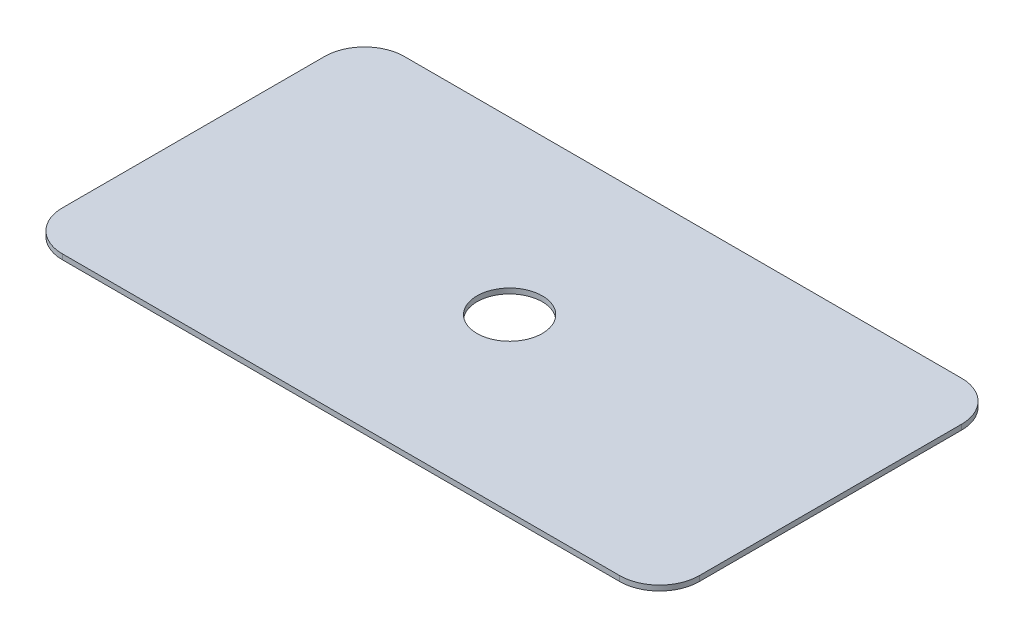
ISO-10303-21;
HEADER;
FILE_DESCRIPTION(('STEP AP214'),'2;1');
FILE_NAME('part.step','',(''),(''),'','','');
FILE_SCHEMA(('AUTOMOTIVE_DESIGN { 1 0 10303 214 1 1 1 1 }'));
ENDSEC;
DATA;
#1=APPLICATION_CONTEXT('core data for automotive mechanical design processes');
#2=APPLICATION_PROTOCOL_DEFINITION('international standard','automotive_design',2000,#1);
#3=PRODUCT_CONTEXT('',#1,'mechanical');
#4=PRODUCT('Part','Part','',(#3));
#5=PRODUCT_RELATED_PRODUCT_CATEGORY('part','',(#4));
#6=PRODUCT_DEFINITION_FORMATION('','',#4);
#7=PRODUCT_DEFINITION_CONTEXT('part definition',#1,'design');
#8=PRODUCT_DEFINITION('design','',#6,#7);
#9=PRODUCT_DEFINITION_SHAPE('','',#8);
#10=(LENGTH_UNIT() NAMED_UNIT(*) SI_UNIT(.MILLI.,.METRE.));
#11=(NAMED_UNIT(*) PLANE_ANGLE_UNIT() SI_UNIT($,.RADIAN.));
#12=(NAMED_UNIT(*) SI_UNIT($,.STERADIAN.) SOLID_ANGLE_UNIT());
#13=UNCERTAINTY_MEASURE_WITH_UNIT(LENGTH_MEASURE(1.E-05),#10,'distance_accuracy_value','');
#14=(GEOMETRIC_REPRESENTATION_CONTEXT(3) GLOBAL_UNCERTAINTY_ASSIGNED_CONTEXT((#13)) GLOBAL_UNIT_ASSIGNED_CONTEXT((#10,
#11,#12)) REPRESENTATION_CONTEXT('',''));
#15=CARTESIAN_POINT('',(0.,0.,0.));
#16=DIRECTION('',(0.,0.,1.));
#17=DIRECTION('',(1.,0.,0.));
#18=AXIS2_PLACEMENT_3D('',#15,#16,#17);
#19=CARTESIAN_POINT('',(-185.,114.579795605042,-15.));
#20=DIRECTION('',(0.,-1.,0.));
#21=DIRECTION('',(0.,0.,-1.));
#22=AXIS2_PLACEMENT_3D('',#19,#20,#21);
#23=CYLINDRICAL_SURFACE('',#22,12.1470910553584);
#24=CARTESIAN_POINT('',(-185.,113.001,-15.));
#25=DIRECTION('',(0.,-1.,0.));
#26=DIRECTION('',(0.,0.,1.));
#27=AXIS2_PLACEMENT_3D('',#24,#25,#26);
#28=CIRCLE('',#27,12.1470910553584);
#29=CARTESIAN_POINT('',(-185.,113.001,-2.85290894464161));
#30=VERTEX_POINT('',#29);
#31=CARTESIAN_POINT('',(-197.147091055358,113.001,-15.));
#32=VERTEX_POINT('',#31);
#33=EDGE_CURVE('E127',#30,#32,#28,.T.);
#34=ORIENTED_EDGE('',*,*,#33,.F.);
#35=DIRECTION('',(0.,-1.,0.));
#36=VECTOR('',#35,1.);
#37=CARTESIAN_POINT('',(-185.,114.579795605042,-2.85290894464161));
#38=LINE('',#37,#36);
#39=CARTESIAN_POINT('',(-185.,114.579795605042,-2.85290894464161));
#40=VERTEX_POINT('',#39);
#41=EDGE_CURVE('E38',#40,#30,#38,.T.);
#42=ORIENTED_EDGE('',*,*,#41,.F.);
#43=CARTESIAN_POINT('',(-185.,114.579795605042,-15.));
#44=DIRECTION('',(0.,-1.,0.));
#45=DIRECTION('',(0.,0.,1.));
#46=AXIS2_PLACEMENT_3D('',#43,#44,#45);
#47=CIRCLE('',#46,12.1470910553584);
#48=CARTESIAN_POINT('',(-197.147091055358,114.579795605042,-15.));
#49=VERTEX_POINT('',#48);
#50=EDGE_CURVE('E311',#40,#49,#47,.T.);
#51=ORIENTED_EDGE('',*,*,#50,.T.);
#52=DIRECTION('',(0.,-1.,0.));
#53=VECTOR('',#52,1.);
#54=CARTESIAN_POINT('',(-197.147091055358,114.579795605042,-15.));
#55=LINE('',#54,#53);
#56=EDGE_CURVE('E10',#49,#32,#55,.T.);
#57=ORIENTED_EDGE('',*,*,#56,.T.);
#58=EDGE_LOOP('',(#34,#42,#51,#57));
#59=FACE_BOUND('',#58,.T.);
#60=ADVANCED_FACE('F16',(#59),#23,.T.);
#61=CARTESIAN_POINT('',(-197.147091055358,114.579795605042,-15.));
#62=DIRECTION('',(-1.,0.,0.));
#63=DIRECTION('',(0.,0.,1.));
#64=AXIS2_PLACEMENT_3D('',#61,#62,#63);
#65=PLANE('',#64);
#66=DIRECTION('',(0.,0.,-1.));
#67=VECTOR('',#66,1.);
#68=CARTESIAN_POINT('',(-197.147091055358,113.001,-15.));
#69=LINE('',#68,#67);
#70=CARTESIAN_POINT('',(-197.147091055358,113.001,-95.));
#71=VERTEX_POINT('',#70);
#72=EDGE_CURVE('E168',#32,#71,#69,.T.);
#73=ORIENTED_EDGE('',*,*,#72,.F.);
#74=ORIENTED_EDGE('',*,*,#56,.F.);
#75=DIRECTION('',(0.,0.,-1.));
#76=VECTOR('',#75,1.);
#77=CARTESIAN_POINT('',(-197.147091055358,114.579795605042,-15.));
#78=LINE('',#77,#76);
#79=CARTESIAN_POINT('',(-197.147091055358,114.579795605042,-95.));
#80=VERTEX_POINT('',#79);
#81=EDGE_CURVE('E322',#49,#80,#78,.T.);
#82=ORIENTED_EDGE('',*,*,#81,.T.);
#83=DIRECTION('',(0.,-1.,0.));
#84=VECTOR('',#83,1.);
#85=CARTESIAN_POINT('',(-197.147091055358,114.579795605042,-95.));
#86=LINE('',#85,#84);
#87=EDGE_CURVE('E29',#80,#71,#86,.T.);
#88=ORIENTED_EDGE('',*,*,#87,.T.);
#89=EDGE_LOOP('',(#73,#74,#82,#88));
#90=FACE_BOUND('',#89,.T.);
#91=ADVANCED_FACE('F158',(#90),#65,.T.);
#92=CARTESIAN_POINT('',(-185.,114.579795605042,-95.));
#93=DIRECTION('',(0.,-1.,0.));
#94=DIRECTION('',(0.,0.,-1.));
#95=AXIS2_PLACEMENT_3D('',#92,#93,#94);
#96=CYLINDRICAL_SURFACE('',#95,12.1470910553584);
#97=CARTESIAN_POINT('',(-185.,113.001,-95.));
#98=DIRECTION('',(0.,-1.,0.));
#99=DIRECTION('',(-1.,0.,0.));
#100=AXIS2_PLACEMENT_3D('',#97,#98,#99);
#101=CIRCLE('',#100,12.1470910553584);
#102=CARTESIAN_POINT('',(-185.,113.001,-107.147091055358));
#103=VERTEX_POINT('',#102);
#104=EDGE_CURVE('E169',#71,#103,#101,.T.);
#105=ORIENTED_EDGE('',*,*,#104,.F.);
#106=ORIENTED_EDGE('',*,*,#87,.F.);
#107=CARTESIAN_POINT('',(-185.,114.579795605042,-95.));
#108=DIRECTION('',(0.,-1.,0.));
#109=DIRECTION('',(-1.,0.,0.));
#110=AXIS2_PLACEMENT_3D('',#107,#108,#109);
#111=CIRCLE('',#110,12.1470910553584);
#112=CARTESIAN_POINT('',(-185.,114.579795605042,-107.147091055358));
#113=VERTEX_POINT('',#112);
#114=EDGE_CURVE('E324',#80,#113,#111,.T.);
#115=ORIENTED_EDGE('',*,*,#114,.T.);
#116=DIRECTION('',(0.,-1.,0.));
#117=VECTOR('',#116,1.);
#118=CARTESIAN_POINT('',(-185.,114.579795605042,-107.147091055358));
#119=LINE('',#118,#117);
#120=EDGE_CURVE('E196',#113,#103,#119,.T.);
#121=ORIENTED_EDGE('',*,*,#120,.T.);
#122=EDGE_LOOP('',(#105,#106,#115,#121));
#123=FACE_BOUND('',#122,.T.);
#124=ADVANCED_FACE('F154',(#123),#96,.T.);
#125=CARTESIAN_POINT('',(-185.,114.579795605042,-107.147091055358));
#126=DIRECTION('',(0.,0.,-1.));
#127=DIRECTION('',(-1.,0.,0.));
#128=AXIS2_PLACEMENT_3D('',#125,#126,#127);
#129=PLANE('',#128);
#130=DIRECTION('',(1.,0.,0.));
#131=VECTOR('',#130,1.);
#132=CARTESIAN_POINT('',(-185.,113.001,-107.147091055358));
#133=LINE('',#132,#131);
#134=CARTESIAN_POINT('',(-15.,113.001,-107.147091055358));
#135=VERTEX_POINT('',#134);
#136=EDGE_CURVE('E171',#103,#135,#133,.T.);
#137=ORIENTED_EDGE('',*,*,#136,.F.);
#138=ORIENTED_EDGE('',*,*,#120,.F.);
#139=DIRECTION('',(1.,0.,0.));
#140=VECTOR('',#139,1.);
#141=CARTESIAN_POINT('',(-185.,114.579795605042,-107.147091055358));
#142=LINE('',#141,#140);
#143=CARTESIAN_POINT('',(-15.,114.579795605042,-107.147091055358));
#144=VERTEX_POINT('',#143);
#145=EDGE_CURVE('E327',#113,#144,#142,.T.);
#146=ORIENTED_EDGE('',*,*,#145,.T.);
#147=DIRECTION('',(0.,-1.,0.));
#148=VECTOR('',#147,1.);
#149=CARTESIAN_POINT('',(-15.,114.579795605042,-107.147091055358));
#150=LINE('',#149,#148);
#151=EDGE_CURVE('E194',#144,#135,#150,.T.);
#152=ORIENTED_EDGE('',*,*,#151,.T.);
#153=EDGE_LOOP('',(#137,#138,#146,#152));
#154=FACE_BOUND('',#153,.T.);
#155=ADVANCED_FACE('F150',(#154),#129,.T.);
#156=CARTESIAN_POINT('',(-15.,114.579795605042,-95.));
#157=DIRECTION('',(0.,-1.,0.));
#158=DIRECTION('',(0.,0.,-1.));
#159=AXIS2_PLACEMENT_3D('',#156,#157,#158);
#160=CYLINDRICAL_SURFACE('',#159,12.1470910553584);
#161=CARTESIAN_POINT('',(-15.,113.001,-95.));
#162=DIRECTION('',(0.,-1.,0.));
#163=DIRECTION('',(0.,0.,-1.));
#164=AXIS2_PLACEMENT_3D('',#161,#162,#163);
#165=CIRCLE('',#164,12.1470910553584);
#166=CARTESIAN_POINT('',(-2.85290894464162,113.001,-95.));
#167=VERTEX_POINT('',#166);
#168=EDGE_CURVE('E176',#135,#167,#165,.T.);
#169=ORIENTED_EDGE('',*,*,#168,.F.);
#170=ORIENTED_EDGE('',*,*,#151,.F.);
#171=CARTESIAN_POINT('',(-15.,114.579795605042,-95.));
#172=DIRECTION('',(0.,-1.,0.));
#173=DIRECTION('',(0.,0.,-1.));
#174=AXIS2_PLACEMENT_3D('',#171,#172,#173);
#175=CIRCLE('',#174,12.1470910553584);
#176=CARTESIAN_POINT('',(-2.85290894464162,114.579795605042,-95.));
#177=VERTEX_POINT('',#176);
#178=EDGE_CURVE('E109',#144,#177,#175,.T.);
#179=ORIENTED_EDGE('',*,*,#178,.T.);
#180=DIRECTION('',(0.,-1.,0.));
#181=VECTOR('',#180,1.);
#182=CARTESIAN_POINT('',(-2.85290894464162,114.579795605042,-95.));
#183=LINE('',#182,#181);
#184=EDGE_CURVE('E101',#177,#167,#183,.T.);
#185=ORIENTED_EDGE('',*,*,#184,.T.);
#186=EDGE_LOOP('',(#169,#170,#179,#185));
#187=FACE_BOUND('',#186,.T.);
#188=ADVANCED_FACE('F147',(#187),#160,.T.);
#189=CARTESIAN_POINT('',(-2.85290894464162,114.579795605042,-95.));
#190=DIRECTION('',(1.,0.,0.));
#191=DIRECTION('',(0.,0.,-1.));
#192=AXIS2_PLACEMENT_3D('',#189,#190,#191);
#193=PLANE('',#192);
#194=DIRECTION('',(0.,0.,1.));
#195=VECTOR('',#194,1.);
#196=CARTESIAN_POINT('',(-2.85290894464162,113.001,-95.));
#197=LINE('',#196,#195);
#198=CARTESIAN_POINT('',(-2.85290894464163,113.001,-15.));
#199=VERTEX_POINT('',#198);
#200=EDGE_CURVE('E179',#167,#199,#197,.T.);
#201=ORIENTED_EDGE('',*,*,#200,.F.);
#202=ORIENTED_EDGE('',*,*,#184,.F.);
#203=DIRECTION('',(0.,0.,1.));
#204=VECTOR('',#203,1.);
#205=CARTESIAN_POINT('',(-2.85290894464162,114.579795605042,-95.));
#206=LINE('',#205,#204);
#207=CARTESIAN_POINT('',(-2.85290894464163,114.579795605042,-15.));
#208=VERTEX_POINT('',#207);
#209=EDGE_CURVE('E104',#177,#208,#206,.T.);
#210=ORIENTED_EDGE('',*,*,#209,.T.);
#211=DIRECTION('',(0.,-1.,0.));
#212=VECTOR('',#211,1.);
#213=CARTESIAN_POINT('',(-2.85290894464163,114.579795605042,-15.));
#214=LINE('',#213,#212);
#215=EDGE_CURVE('E90',#208,#199,#214,.T.);
#216=ORIENTED_EDGE('',*,*,#215,.T.);
#217=EDGE_LOOP('',(#201,#202,#210,#216));
#218=FACE_BOUND('',#217,.T.);
#219=ADVANCED_FACE('F105',(#218),#193,.T.);
#220=CARTESIAN_POINT('',(-15.,114.579795605042,-15.));
#221=DIRECTION('',(0.,-1.,0.));
#222=DIRECTION('',(0.,0.,-1.));
#223=AXIS2_PLACEMENT_3D('',#220,#221,#222);
#224=CYLINDRICAL_SURFACE('',#223,12.1470910553584);
#225=CARTESIAN_POINT('',(-15.,113.001,-15.));
#226=DIRECTION('',(0.,-1.,0.));
#227=DIRECTION('',(1.,0.,0.));
#228=AXIS2_PLACEMENT_3D('',#225,#226,#227);
#229=CIRCLE('',#228,12.1470910553584);
#230=CARTESIAN_POINT('',(-15.,113.001,-2.85290894464161));
#231=VERTEX_POINT('',#230);
#232=EDGE_CURVE('E97',#199,#231,#229,.T.);
#233=ORIENTED_EDGE('',*,*,#232,.F.);
#234=ORIENTED_EDGE('',*,*,#215,.F.);
#235=CARTESIAN_POINT('',(-15.,114.579795605042,-15.));
#236=DIRECTION('',(0.,-1.,0.));
#237=DIRECTION('',(1.,0.,0.));
#238=AXIS2_PLACEMENT_3D('',#235,#236,#237);
#239=CIRCLE('',#238,12.1470910553584);
#240=CARTESIAN_POINT('',(-15.,114.579795605042,-2.85290894464161));
#241=VERTEX_POINT('',#240);
#242=EDGE_CURVE('E94',#208,#241,#239,.T.);
#243=ORIENTED_EDGE('',*,*,#242,.T.);
#244=DIRECTION('',(0.,-1.,0.));
#245=VECTOR('',#244,1.);
#246=CARTESIAN_POINT('',(-15.,114.579795605042,-2.85290894464161));
#247=LINE('',#246,#245);
#248=EDGE_CURVE('E66',#241,#231,#247,.T.);
#249=ORIENTED_EDGE('',*,*,#248,.T.);
#250=EDGE_LOOP('',(#233,#234,#243,#249));
#251=FACE_BOUND('',#250,.T.);
#252=ADVANCED_FACE('F92',(#251),#224,.T.);
#253=CARTESIAN_POINT('',(-100.72463373605,114.579795605042,-64.9526479897349));
#254=CARTESIAN_POINT('',(-101.37602762007,114.579795605042,-64.9526479897349));
#255=CARTESIAN_POINT('',(-102.678815388109,114.579795605042,-64.8243345941841));
#256=CARTESIAN_POINT('',(-104.557898935198,114.579795605042,-64.2543208319538));
#257=CARTESIAN_POINT('',(-106.289672250403,114.579795605042,-63.3286687100343));
#258=CARTESIAN_POINT('',(-107.807584256411,114.579795605042,-62.0829505203595));
#259=CARTESIAN_POINT('',(-109.053302446085,114.579795605042,-60.5650385143515));
#260=CARTESIAN_POINT('',(-109.978954568005,114.579795605042,-58.8332651991466));
#261=CARTESIAN_POINT('',(-110.548968330235,114.579795605042,-56.9541816520583));
#262=CARTESIAN_POINT('',(-110.741438423561,114.579795605042,-54.9999999999991));
#263=CARTESIAN_POINT('',(-110.548968330235,114.579795605042,-53.0458183479399));
#264=CARTESIAN_POINT('',(-109.978954568005,114.579795605042,-51.1667348008517));
#265=CARTESIAN_POINT('',(-109.053302446086,114.579795605042,-49.4349614856467));
#266=CARTESIAN_POINT('',(-107.807584256411,114.579795605042,-47.9170494796388));
#267=CARTESIAN_POINT('',(-106.289672250403,114.579795605042,-46.6713312899639));
#268=CARTESIAN_POINT('',(-104.557898935198,114.579795605042,-45.7456791680445));
#269=CARTESIAN_POINT('',(-102.678815388109,114.579795605042,-45.1756654058141));
#270=CARTESIAN_POINT('',(-100.72463373605,114.579795605042,-44.983195312488));
#271=CARTESIAN_POINT('',(-98.7704520839911,114.579795605042,-45.1756654058141));
#272=CARTESIAN_POINT('',(-96.8913685369028,114.579795605042,-45.7456791680445));
#273=CARTESIAN_POINT('',(-95.1595952216979,114.579795605042,-46.6713312899639));
#274=CARTESIAN_POINT('',(-93.64168321569,114.579795605042,-47.9170494796388));
#275=CARTESIAN_POINT('',(-92.3959650260151,114.579795605042,-49.4349614856467));
#276=CARTESIAN_POINT('',(-91.4703129040957,114.579795605042,-51.1667348008517));
#277=CARTESIAN_POINT('',(-90.9002991418653,114.579795605042,-53.0458183479399));
#278=CARTESIAN_POINT('',(-90.7078290485392,114.579795605042,-54.9999999999991));
#279=CARTESIAN_POINT('',(-90.9002991418653,114.579795605042,-56.9541816520583));
#280=CARTESIAN_POINT('',(-91.4703129040956,114.579795605042,-58.8332651991466));
#281=CARTESIAN_POINT('',(-92.3959650260151,114.579795605042,-60.5650385143515));
#282=CARTESIAN_POINT('',(-93.64168321569,114.579795605042,-62.0829505203594));
#283=CARTESIAN_POINT('',(-95.1595952216979,114.579795605042,-63.3286687100343));
#284=CARTESIAN_POINT('',(-96.8913685369028,114.579795605042,-64.2543208319537));
#285=CARTESIAN_POINT('',(-98.7704520839911,114.579795605042,-64.8243345941841));
#286=CARTESIAN_POINT('',(-100.073239852031,114.579795605042,-64.9526479897349));
#287=CARTESIAN_POINT('',(-100.72463373605,114.579795605042,-64.9526479897349));
#288=B_SPLINE_CURVE_WITH_KNOTS('',3,(#253,#254,#255,#256,#257,#258,#259,#260,#261,#262,#263,
#264,#265,#266,#267,#268,#269,#270,#271,#272,#273,#274,#275,#276,#277,#278,#279,#280,#281,#282,
#283,#284,#285,#286,#287),.UNSPECIFIED.,.T.,.F.,(4,1,1,1,1,1,1,1,1,1,1,1,1,1,1,1,1,1,1,1,1,1,1,
1,1,1,1,1,1,1,1,1,4),(0.,0.03125,0.0625000000000001,0.09375,0.125,0.15625,0.1875,0.21875,0.25,
0.28125,0.3125,0.34375,0.375,0.40625,0.4375,0.46875,0.5,0.53125,0.5625,0.59375,0.625,0.65625,
0.6875,0.71875,0.75,0.78125,0.8125,0.84375,0.875,0.90625,0.9375,0.96875,1.),.UNSPECIFIED.);
#289=DIRECTION('',(0.,-1.,0.));
#290=VECTOR('',#289,1.);
#291=SURFACE_OF_LINEAR_EXTRUSION('',#288,#290);
#292=CARTESIAN_POINT('',(-100.72463373605,114.579795605042,-64.9526479897349));
#293=CARTESIAN_POINT('',(-101.37602762007,114.579795605042,-64.9526479897349));
#294=CARTESIAN_POINT('',(-102.678815388109,114.579795605042,-64.8243345941841));
#295=CARTESIAN_POINT('',(-104.557898935198,114.579795605042,-64.2543208319538));
#296=CARTESIAN_POINT('',(-106.289672250403,114.579795605042,-63.3286687100343));
#297=CARTESIAN_POINT('',(-107.807584256411,114.579795605042,-62.0829505203595));
#298=CARTESIAN_POINT('',(-109.053302446085,114.579795605042,-60.5650385143515));
#299=CARTESIAN_POINT('',(-109.978954568005,114.579795605042,-58.8332651991466));
#300=CARTESIAN_POINT('',(-110.548968330235,114.579795605042,-56.9541816520583));
#301=CARTESIAN_POINT('',(-110.741438423561,114.579795605042,-54.9999999999991));
#302=CARTESIAN_POINT('',(-110.548968330235,114.579795605042,-53.0458183479399));
#303=CARTESIAN_POINT('',(-109.978954568005,114.579795605042,-51.1667348008517));
#304=CARTESIAN_POINT('',(-109.053302446086,114.579795605042,-49.4349614856467));
#305=CARTESIAN_POINT('',(-107.807584256411,114.579795605042,-47.9170494796388));
#306=CARTESIAN_POINT('',(-106.289672250403,114.579795605042,-46.6713312899639));
#307=CARTESIAN_POINT('',(-104.557898935198,114.579795605042,-45.7456791680445));
#308=CARTESIAN_POINT('',(-102.678815388109,114.579795605042,-45.1756654058141));
#309=CARTESIAN_POINT('',(-100.72463373605,114.579795605042,-44.983195312488));
#310=CARTESIAN_POINT('',(-98.7704520839911,114.579795605042,-45.1756654058141));
#311=CARTESIAN_POINT('',(-96.8913685369028,114.579795605042,-45.7456791680445));
#312=CARTESIAN_POINT('',(-95.1595952216979,114.579795605042,-46.6713312899639));
#313=CARTESIAN_POINT('',(-93.64168321569,114.579795605042,-47.9170494796388));
#314=CARTESIAN_POINT('',(-92.3959650260151,114.579795605042,-49.4349614856467));
#315=CARTESIAN_POINT('',(-91.4703129040957,114.579795605042,-51.1667348008517));
#316=CARTESIAN_POINT('',(-90.9002991418653,114.579795605042,-53.0458183479399));
#317=CARTESIAN_POINT('',(-90.7078290485392,114.579795605042,-54.9999999999991));
#318=CARTESIAN_POINT('',(-90.9002991418653,114.579795605042,-56.9541816520583));
#319=CARTESIAN_POINT('',(-91.4703129040956,114.579795605042,-58.8332651991466));
#320=CARTESIAN_POINT('',(-92.3959650260151,114.579795605042,-60.5650385143515));
#321=CARTESIAN_POINT('',(-93.64168321569,114.579795605042,-62.0829505203594));
#322=CARTESIAN_POINT('',(-95.1595952216979,114.579795605042,-63.3286687100343));
#323=CARTESIAN_POINT('',(-96.8913685369028,114.579795605042,-64.2543208319537));
#324=CARTESIAN_POINT('',(-98.7704520839911,114.579795605042,-64.8243345941841));
#325=CARTESIAN_POINT('',(-100.073239852031,114.579795605042,-64.9526479897349));
#326=CARTESIAN_POINT('',(-100.72463373605,114.579795605042,-64.9526479897349));
#327=B_SPLINE_CURVE_WITH_KNOTS('',3,(#292,#293,#294,#295,#296,#297,#298,#299,#300,#301,#302,
#303,#304,#305,#306,#307,#308,#309,#310,#311,#312,#313,#314,#315,#316,#317,#318,#319,#320,#321,
#322,#323,#324,#325,#326),.UNSPECIFIED.,.T.,.F.,(4,1,1,1,1,1,1,1,1,1,1,1,1,1,1,1,1,1,1,1,1,1,1,
1,1,1,1,1,1,1,1,1,4),(0.,0.03125,0.0625000000000001,0.09375,0.125,0.15625,0.1875,0.21875,0.25,
0.28125,0.3125,0.34375,0.375,0.40625,0.4375,0.46875,0.5,0.53125,0.5625,0.59375,0.625,0.65625,
0.6875,0.71875,0.75,0.78125,0.8125,0.84375,0.875,0.90625,0.9375,0.96875,1.),.UNSPECIFIED.);
#328=CARTESIAN_POINT('',(-100.72463373605,114.579795605042,-64.9526479897349));
#329=VERTEX_POINT('',#328);
#330=EDGE_CURVE('E183',#329,#329,#327,.T.);
#331=ORIENTED_EDGE('',*,*,#330,.T.);
#332=EDGE_LOOP('',(#331));
#333=FACE_BOUND('',#332,.T.);
#334=CARTESIAN_POINT('',(-100.72463373605,113.001,-64.9526479897349));
#335=CARTESIAN_POINT('',(-100.561784265097,113.001,-64.9526479559564));
#336=CARTESIAN_POINT('',(-100.398935979341,113.001,-64.9486381482371));
#337=CARTESIAN_POINT('',(-100.07363053923,113.001,-64.9326375309517));
#338=CARTESIAN_POINT('',(-99.9111733879229,113.001,-64.9206466593903));
#339=CARTESIAN_POINT('',(-99.5870415198256,113.001,-64.8887224616558));
#340=CARTESIAN_POINT('',(-99.4253668030355,113.001,-64.8687891354827));
#341=CARTESIAN_POINT('',(-99.1031901132992,113.001,-64.821018309842));
#342=CARTESIAN_POINT('',(-98.942688131253,113.001,-64.793180871774));
#343=CARTESIAN_POINT('',(-98.6232487383862,113.001,-64.7296404269595));
#344=CARTESIAN_POINT('',(-98.4643113275655,113.001,-64.693937420213));
#345=CARTESIAN_POINT('',(-98.1483777516117,113.001,-64.614780218036));
#346=CARTESIAN_POINT('',(-97.9913816015676,113.001,-64.5713259623972));
#347=CARTESIAN_POINT('',(-97.679706033362,113.001,-64.4767802125493));
#348=CARTESIAN_POINT('',(-97.5250266152005,113.001,-64.4256887183401));
#349=CARTESIAN_POINT('',(-97.2183600605424,113.001,-64.3159822351679));
#350=CARTESIAN_POINT('',(-97.0663729031418,113.001,-64.2573673046492));
#351=CARTESIAN_POINT('',(-96.7654675812916,113.001,-64.1327282393619));
#352=CARTESIAN_POINT('',(-96.6165494168421,113.001,-64.0667041045933));
#353=CARTESIAN_POINT('',(-96.322129218198,113.001,-63.9274323023318));
#354=CARTESIAN_POINT('',(-96.1766272105487,113.001,-63.8541845787313));
#355=CARTESIAN_POINT('',(-95.8893853622637,113.001,-63.7006506121132));
#356=CARTESIAN_POINT('',(-95.7476455216281,113.001,-63.6203643690956));
#357=CARTESIAN_POINT('',(-95.4682741518256,113.001,-63.4529381883027));
#358=CARTESIAN_POINT('',(-95.3306425907546,113.001,-63.3657983037706));
#359=CARTESIAN_POINT('',(-95.0598349557068,113.001,-63.1848504270463));
#360=CARTESIAN_POINT('',(-94.92665888173,113.001,-63.0910424348541));
#361=CARTESIAN_POINT('',(-94.6650664653881,113.001,-62.8970081698569));
#362=CARTESIAN_POINT('',(-94.5366501600041,113.001,-62.7967818472011));
#363=CARTESIAN_POINT('',(-94.2848805742809,113.001,-62.5901598880223));
#364=CARTESIAN_POINT('',(-94.1615272939416,113.001,-62.4837642514994));
#365=CARTESIAN_POINT('',(-93.9201871941974,113.001,-62.2650524673265));
#366=CARTESIAN_POINT('',(-93.8022003331141,113.001,-62.1527363656725));
#367=CARTESIAN_POINT('',(-93.5718973703769,113.001,-61.9224334029353));
#368=CARTESIAN_POINT('',(-93.4595812687229,113.001,-61.8044465418521));
#369=CARTESIAN_POINT('',(-93.2408694845501,113.001,-61.5631064421078));
#370=CARTESIAN_POINT('',(-93.1344738480271,113.001,-61.4397531617686));
#371=CARTESIAN_POINT('',(-92.9278518888484,113.001,-61.1879835760453));
#372=CARTESIAN_POINT('',(-92.8276255661925,113.001,-61.0595672706614));
#373=CARTESIAN_POINT('',(-92.6335913011953,113.001,-60.7979748543194));
#374=CARTESIAN_POINT('',(-92.5397833090032,113.001,-60.6647987803425));
#375=CARTESIAN_POINT('',(-92.3588354322789,113.001,-60.3939911452949));
#376=CARTESIAN_POINT('',(-92.2716955477468,113.001,-60.2563595842242));
#377=CARTESIAN_POINT('',(-92.1042693669538,113.001,-59.976988214421));
#378=CARTESIAN_POINT('',(-92.0239831239362,113.001,-59.8352483737844));
#379=CARTESIAN_POINT('',(-91.8704491573181,113.001,-59.548006525502));
#380=CARTESIAN_POINT('',(-91.7972014337178,113.001,-59.4025045178563));
#381=CARTESIAN_POINT('',(-91.6579296314558,113.001,-59.1080843192025));
#382=CARTESIAN_POINT('',(-91.5919054966866,113.001,-58.9591661547396));
#383=CARTESIAN_POINT('',(-91.4672664314011,113.001,-58.6582608329258));
#384=CARTESIAN_POINT('',(-91.4086515008848,113.001,-58.5062736755749));
#385=CARTESIAN_POINT('',(-91.298945017706,113.001,-58.199607120781));
#386=CARTESIAN_POINT('',(-91.2478535234876,113.001,-58.0449277024342));
#387=CARTESIAN_POINT('',(-91.1533077736647,113.001,-57.7332521347351));
#388=CARTESIAN_POINT('',(-91.1098535180601,113.001,-57.5762559853829));
#389=CARTESIAN_POINT('',(-91.0306963157897,113.001,-57.2603224075388));
#390=CARTESIAN_POINT('',(-90.9949933089158,113.001,-57.101384994136));
#391=CARTESIAN_POINT('',(-90.9314528644496,113.001,-56.7819456083237));
#392=CARTESIAN_POINT('',(-90.9036154268573,113.001,-56.6214436359142));
#393=CARTESIAN_POINT('',(-90.8558445999169,113.001,-56.2992669198498));
#394=CARTESIAN_POINT('',(-90.8359112719684,113.001,-56.1375921670946));
#395=CARTESIAN_POINT('',(-90.8039870790843,113.001,-55.8134603972558));
#396=CARTESIAN_POINT('',(-90.7919962141488,113.001,-55.6510033801722));
#397=CARTESIAN_POINT('',(-90.7759955787615,113.001,-55.3256975733568));
#398=CARTESIAN_POINT('',(-90.7719857463146,113.001,-55.162848786678));
#399=CARTESIAN_POINT('',(-90.7719857463146,113.001,-54.8371512133203));
#400=CARTESIAN_POINT('',(-90.7759955787615,113.001,-54.6743024266414));
#401=CARTESIAN_POINT('',(-90.7919962141489,113.001,-54.348996619826));
#402=CARTESIAN_POINT('',(-90.8039870790844,113.001,-54.1865396027425));
#403=CARTESIAN_POINT('',(-90.8359112719684,113.001,-53.8624078329037));
#404=CARTESIAN_POINT('',(-90.855844599917,113.001,-53.7007330801484));
#405=CARTESIAN_POINT('',(-90.9036154268573,113.001,-53.378556364084));
#406=CARTESIAN_POINT('',(-90.9314528644496,113.001,-53.2180543916746));
#407=CARTESIAN_POINT('',(-90.9949933089158,113.001,-52.8986150058623));
#408=CARTESIAN_POINT('',(-91.0306963157898,113.001,-52.7396775924594));
#409=CARTESIAN_POINT('',(-91.1098535180601,113.001,-52.4237440146153));
#410=CARTESIAN_POINT('',(-91.1533077736647,113.001,-52.2667478652631));
#411=CARTESIAN_POINT('',(-91.2478535234877,113.001,-51.955072297564));
#412=CARTESIAN_POINT('',(-91.298945017706,113.001,-51.8003928792172));
#413=CARTESIAN_POINT('',(-91.4086515008849,113.001,-51.4937263244233));
#414=CARTESIAN_POINT('',(-91.4672664314011,113.001,-51.3417391670724));
#415=CARTESIAN_POINT('',(-91.5919054966866,113.001,-51.0408338452586));
#416=CARTESIAN_POINT('',(-91.6579296314559,113.001,-50.8919156807958));
#417=CARTESIAN_POINT('',(-91.7972014337179,113.001,-50.597495482142));
#418=CARTESIAN_POINT('',(-91.8704491573182,113.001,-50.4519934744962));
#419=CARTESIAN_POINT('',(-92.0239831239362,113.001,-50.1647516262138));
#420=CARTESIAN_POINT('',(-92.1042693669539,113.001,-50.0230117855773));
#421=CARTESIAN_POINT('',(-92.2716955477468,113.001,-49.7436404157741));
#422=CARTESIAN_POINT('',(-92.3588354322789,113.001,-49.6060088547034));
#423=CARTESIAN_POINT('',(-92.5397833090032,113.001,-49.3352012196558));
#424=CARTESIAN_POINT('',(-92.6335913011953,113.001,-49.2020251456788));
#425=CARTESIAN_POINT('',(-92.8276255661925,113.001,-48.9404327293369));
#426=CARTESIAN_POINT('',(-92.9278518888484,113.001,-48.8120164239529));
#427=CARTESIAN_POINT('',(-93.1344738480271,113.001,-48.5602468382297));
#428=CARTESIAN_POINT('',(-93.2408694845501,113.001,-48.4368935578904));
#429=CARTESIAN_POINT('',(-93.4595812687229,113.001,-48.1955534581462));
#430=CARTESIAN_POINT('',(-93.5718973703769,113.001,-48.0775665970629));
#431=CARTESIAN_POINT('',(-93.8022003331141,113.001,-47.8472636343257));
#432=CARTESIAN_POINT('',(-93.9201871941974,113.001,-47.7349475326717));
#433=CARTESIAN_POINT('',(-94.1615272939416,113.001,-47.5162357484988));
#434=CARTESIAN_POINT('',(-94.2848805742809,113.001,-47.4098401119759));
#435=CARTESIAN_POINT('',(-94.5366501600041,113.001,-47.2032181527971));
#436=CARTESIAN_POINT('',(-94.6650664653881,113.001,-47.1029918301413));
#437=CARTESIAN_POINT('',(-94.92665888173,113.001,-46.9089575651441));
#438=CARTESIAN_POINT('',(-95.0598349557069,113.001,-46.815149572952));
#439=CARTESIAN_POINT('',(-95.3306425907545,113.001,-46.6342016962277));
#440=CARTESIAN_POINT('',(-95.4682741518252,113.001,-46.5470618116956));
#441=CARTESIAN_POINT('',(-95.7476455216284,113.001,-46.3796356309026));
#442=CARTESIAN_POINT('',(-95.889385362265,113.001,-46.299349387885));
#443=CARTESIAN_POINT('',(-96.1766272105474,113.001,-46.145815421267));
#444=CARTESIAN_POINT('',(-96.3221292181932,113.001,-46.0725676976666));
#445=CARTESIAN_POINT('',(-96.6165494168469,113.001,-45.9332958954047));
#446=CARTESIAN_POINT('',(-96.7654675813098,113.001,-45.8672717606354));
#447=CARTESIAN_POINT('',(-97.0663729031236,113.001,-45.7426326953499));
#448=CARTESIAN_POINT('',(-97.2183600604745,113.001,-45.6840177648336));
#449=CARTESIAN_POINT('',(-97.5250266152684,113.001,-45.5743112816548));
#450=CARTESIAN_POINT('',(-97.6797060336152,113.001,-45.5232197874365));
#451=CARTESIAN_POINT('',(-97.9913816013143,113.001,-45.4286740376135));
#452=CARTESIAN_POINT('',(-98.1483777506665,113.001,-45.3852197820089));
#453=CARTESIAN_POINT('',(-98.4643113285106,113.001,-45.3060625797385));
#454=CARTESIAN_POINT('',(-98.6232487419134,113.001,-45.2703595728646));
#455=CARTESIAN_POINT('',(-98.9426881277257,113.001,-45.2068191283984));
#456=CARTESIAN_POINT('',(-99.1031901001352,113.001,-45.1789816908061));
#457=CARTESIAN_POINT('',(-99.4253668161996,113.001,-45.1312108638658));
#458=CARTESIAN_POINT('',(-99.5870415689549,113.001,-45.1112775359172));
#459=CARTESIAN_POINT('',(-99.9111733387937,113.001,-45.0793533430331));
#460=CARTESIAN_POINT('',(-100.073630355877,113.001,-45.0673624780976));
#461=CARTESIAN_POINT('',(-100.398936162693,113.001,-45.0513618427103));
#462=CARTESIAN_POINT('',(-100.561784949371,113.001,-45.0473520102634));
#463=CARTESIAN_POINT('',(-100.887482522729,113.001,-45.0473520102634));
#464=CARTESIAN_POINT('',(-101.050331309408,113.001,-45.0513618427103));
#465=CARTESIAN_POINT('',(-101.375637116223,113.001,-45.0673624780976));
#466=CARTESIAN_POINT('',(-101.538094133307,113.001,-45.0793533430331));
#467=CARTESIAN_POINT('',(-101.862225903146,113.001,-45.1112775359172));
#468=CARTESIAN_POINT('',(-102.023900655901,113.001,-45.1312108638658));
#469=CARTESIAN_POINT('',(-102.346077371965,113.001,-45.1789816908061));
#470=CARTESIAN_POINT('',(-102.506579344375,113.001,-45.2068191283984));
#471=CARTESIAN_POINT('',(-102.826018730187,113.001,-45.2703595728646));
#472=CARTESIAN_POINT('',(-102.98495614359,113.001,-45.3060625797386));
#473=CARTESIAN_POINT('',(-103.300889721434,113.001,-45.3852197820089));
#474=CARTESIAN_POINT('',(-103.457885870786,113.001,-45.4286740376135));
#475=CARTESIAN_POINT('',(-103.769561438485,113.001,-45.5232197874365));
#476=CARTESIAN_POINT('',(-103.924240856832,113.001,-45.5743112816548));
#477=CARTESIAN_POINT('',(-104.230907411626,113.001,-45.6840177648336));
#478=CARTESIAN_POINT('',(-104.382894568977,113.001,-45.7426326953499));
#479=CARTESIAN_POINT('',(-104.683799890791,113.001,-45.8672717606354));
#480=CARTESIAN_POINT('',(-104.832718055254,113.001,-45.9332958954047));
#481=CARTESIAN_POINT('',(-105.127138253908,113.001,-46.0725676976666));
#482=CARTESIAN_POINT('',(-105.272640261553,113.001,-46.145815421267));
#483=CARTESIAN_POINT('',(-105.559882109836,113.001,-46.299349387885));
#484=CARTESIAN_POINT('',(-105.701621950472,113.001,-46.3796356309027));
#485=CARTESIAN_POINT('',(-105.980993320275,113.001,-46.5470618116956));
#486=CARTESIAN_POINT('',(-106.118624881346,113.001,-46.6342016962277));
#487=CARTESIAN_POINT('',(-106.389432516394,113.001,-46.815149572952));
#488=CARTESIAN_POINT('',(-106.522608590371,113.001,-46.9089575651441));
#489=CARTESIAN_POINT('',(-106.784201006713,113.001,-47.1029918301413));
#490=CARTESIAN_POINT('',(-106.912617312097,113.001,-47.2032181527972));
#491=CARTESIAN_POINT('',(-107.16438689782,113.001,-47.4098401119759));
#492=CARTESIAN_POINT('',(-107.287740178159,113.001,-47.5162357484989));
#493=CARTESIAN_POINT('',(-107.529080277903,113.001,-47.7349475326717));
#494=CARTESIAN_POINT('',(-107.647067138987,113.001,-47.8472636343257));
#495=CARTESIAN_POINT('',(-107.877370101724,113.001,-48.0775665970629));
#496=CARTESIAN_POINT('',(-107.989686203378,113.001,-48.1955534581462));
#497=CARTESIAN_POINT('',(-108.208397987551,113.001,-48.4368935578904));
#498=CARTESIAN_POINT('',(-108.314793624074,113.001,-48.5602468382297));
#499=CARTESIAN_POINT('',(-108.521415583252,113.001,-48.8120164239529));
#500=CARTESIAN_POINT('',(-108.621641905908,113.001,-48.9404327293369));
#501=CARTESIAN_POINT('',(-108.815676170905,113.001,-49.2020251456789));
#502=CARTESIAN_POINT('',(-108.909484163097,113.001,-49.3352012196558));
#503=CARTESIAN_POINT('',(-109.090432039822,113.001,-49.6060088547034));
#504=CARTESIAN_POINT('',(-109.177571924354,113.001,-49.7436404157741));
#505=CARTESIAN_POINT('',(-109.344998105147,113.001,-50.0230117855773));
#506=CARTESIAN_POINT('',(-109.425284348164,113.001,-50.1647516262139));
#507=CARTESIAN_POINT('',(-109.578818314782,113.001,-50.4519934744962));
#508=CARTESIAN_POINT('',(-109.652066038383,113.001,-50.597495482142));
#509=CARTESIAN_POINT('',(-109.791337840645,113.001,-50.8919156807958));
#510=CARTESIAN_POINT('',(-109.857361975414,113.001,-51.0408338452587));
#511=CARTESIAN_POINT('',(-109.9820010407,113.001,-51.3417391670724));
#512=CARTESIAN_POINT('',(-110.040615971216,113.001,-51.4937263244233));
#513=CARTESIAN_POINT('',(-110.150322454395,113.001,-51.8003928792172));
#514=CARTESIAN_POINT('',(-110.201413948613,113.001,-51.9550722975641));
#515=CARTESIAN_POINT('',(-110.295959698436,113.001,-52.2667478652631));
#516=CARTESIAN_POINT('',(-110.339413954041,113.001,-52.4237440146154));
#517=CARTESIAN_POINT('',(-110.418571156311,113.001,-52.7396775924594));
#518=CARTESIAN_POINT('',(-110.454274163185,113.001,-52.8986150058623));
#519=CARTESIAN_POINT('',(-110.517814607651,113.001,-53.2180543916746));
#520=CARTESIAN_POINT('',(-110.545652045243,113.001,-53.378556364084));
#521=CARTESIAN_POINT('',(-110.593422872184,113.001,-53.7007330801484));
#522=CARTESIAN_POINT('',(-110.613356200132,113.001,-53.8624078329037));
#523=CARTESIAN_POINT('',(-110.645280393016,113.001,-54.1865396027425));
#524=CARTESIAN_POINT('',(-110.657271257952,113.001,-54.348996619826));
#525=CARTESIAN_POINT('',(-110.673271893339,113.001,-54.6743024266414));
#526=CARTESIAN_POINT('',(-110.677281725786,113.001,-54.8371512133203));
#527=CARTESIAN_POINT('',(-110.677281725786,113.001,-55.162848786678));
#528=CARTESIAN_POINT('',(-110.673271893339,113.001,-55.3256975733568));
#529=CARTESIAN_POINT('',(-110.657271257952,113.001,-55.6510033801723));
#530=CARTESIAN_POINT('',(-110.645280393016,113.001,-55.8134603972558));
#531=CARTESIAN_POINT('',(-110.613356200132,113.001,-56.1375921670946));
#532=CARTESIAN_POINT('',(-110.593422872184,113.001,-56.2992669198498));
#533=CARTESIAN_POINT('',(-110.545652045243,113.001,-56.6214436359143));
#534=CARTESIAN_POINT('',(-110.517814607651,113.001,-56.7819456083237));
#535=CARTESIAN_POINT('',(-110.454274163185,113.001,-57.101384994136));
#536=CARTESIAN_POINT('',(-110.418571156311,113.001,-57.2603224075388));
#537=CARTESIAN_POINT('',(-110.339413954041,113.001,-57.5762559853829));
#538=CARTESIAN_POINT('',(-110.295959698436,113.001,-57.7332521347351));
#539=CARTESIAN_POINT('',(-110.201413948613,113.001,-58.0449277024342));
#540=CARTESIAN_POINT('',(-110.150322454395,113.001,-58.1996071207811));
#541=CARTESIAN_POINT('',(-110.040615971216,113.001,-58.5062736755749));
#542=CARTESIAN_POINT('',(-109.9820010407,113.001,-58.6582608329258));
#543=CARTESIAN_POINT('',(-109.857361975414,113.001,-58.9591661547396));
#544=CARTESIAN_POINT('',(-109.791337840645,113.001,-59.1080843192025));
#545=CARTESIAN_POINT('',(-109.652066038383,113.001,-59.4025045178563));
#546=CARTESIAN_POINT('',(-109.578818314782,113.001,-59.5480065255021));
#547=CARTESIAN_POINT('',(-109.425284348164,113.001,-59.8352483737844));
#548=CARTESIAN_POINT('',(-109.344998105147,113.001,-59.976988214421));
#549=CARTESIAN_POINT('',(-109.177571924354,113.001,-60.2563595842242));
#550=CARTESIAN_POINT('',(-109.090432039822,113.001,-60.3939911452949));
#551=CARTESIAN_POINT('',(-108.909484163097,113.001,-60.6647987803425));
#552=CARTESIAN_POINT('',(-108.815676170905,113.001,-60.7979748543194));
#553=CARTESIAN_POINT('',(-108.621641905908,113.001,-61.0595672706614));
#554=CARTESIAN_POINT('',(-108.521415583252,113.001,-61.1879835760453));
#555=CARTESIAN_POINT('',(-108.314793624073,113.001,-61.4397531617686));
#556=CARTESIAN_POINT('',(-108.208397987551,113.001,-61.5631064421079));
#557=CARTESIAN_POINT('',(-107.989686203378,113.001,-61.8044465418521));
#558=CARTESIAN_POINT('',(-107.877370101724,113.001,-61.9224334029353));
#559=CARTESIAN_POINT('',(-107.647067138986,113.001,-62.1527363656726));
#560=CARTESIAN_POINT('',(-107.529080277903,113.001,-62.2650524673266));
#561=CARTESIAN_POINT('',(-107.287740178159,113.001,-62.4837642514994));
#562=CARTESIAN_POINT('',(-107.16438689782,113.001,-62.5901598880223));
#563=CARTESIAN_POINT('',(-106.912617312097,113.001,-62.7967818472011));
#564=CARTESIAN_POINT('',(-106.784201006713,113.001,-62.897008169857));
#565=CARTESIAN_POINT('',(-106.522608590371,113.001,-63.0910424348541));
#566=CARTESIAN_POINT('',(-106.389432516394,113.001,-63.1848504270463));
#567=CARTESIAN_POINT('',(-106.118624881346,113.001,-63.3657983037706));
#568=CARTESIAN_POINT('',(-105.980993320275,113.001,-63.4529381883027));
#569=CARTESIAN_POINT('',(-105.701621950473,113.001,-63.6203643690956));
#570=CARTESIAN_POINT('',(-105.559882109837,113.001,-63.7006506121132));
#571=CARTESIAN_POINT('',(-105.272640261552,113.001,-63.8541845787313));
#572=CARTESIAN_POINT('',(-105.127138253903,113.001,-63.9274323023318));
#573=CARTESIAN_POINT('',(-104.832718055259,113.001,-64.0667041045934));
#574=CARTESIAN_POINT('',(-104.683799890809,113.001,-64.1327282393619));
#575=CARTESIAN_POINT('',(-104.382894568959,113.001,-64.2573673046493));
#576=CARTESIAN_POINT('',(-104.230907411558,113.001,-64.315982235168));
#577=CARTESIAN_POINT('',(-103.9242408569,113.001,-64.4256887183401));
#578=CARTESIAN_POINT('',(-103.769561438739,113.001,-64.4767802125493));
#579=CARTESIAN_POINT('',(-103.457885870533,113.001,-64.5713259623972));
#580=CARTESIAN_POINT('',(-103.300889720489,113.001,-64.614780218036));
#581=CARTESIAN_POINT('',(-102.984956144535,113.001,-64.693937420213));
#582=CARTESIAN_POINT('',(-102.826018733714,113.001,-64.7296404269595));
#583=CARTESIAN_POINT('',(-102.506579340848,113.001,-64.793180871774));
#584=CARTESIAN_POINT('',(-102.346077358801,113.001,-64.821018309842));
#585=CARTESIAN_POINT('',(-102.023900669065,113.001,-64.8687891354826));
#586=CARTESIAN_POINT('',(-101.862225952275,113.001,-64.8887224616558));
#587=CARTESIAN_POINT('',(-101.538094084178,113.001,-64.9206466593903));
#588=CARTESIAN_POINT('',(-101.375636932871,113.001,-64.9326375309517));
#589=CARTESIAN_POINT('',(-101.05033149276,113.001,-64.948638148237));
#590=CARTESIAN_POINT('',(-100.887483207004,113.001,-64.9526479559564));
#591=CARTESIAN_POINT('',(-100.72463373605,113.001,-64.9526479897349));
#592=B_SPLINE_CURVE_WITH_KNOTS('',3,(#334,#335,#336,#337,#338,#339,#340,#341,#342,#343,#344,
#345,#346,#347,#348,#349,#350,#351,#352,#353,#354,#355,#356,#357,#358,#359,#360,#361,#362,#363,
#364,#365,#366,#367,#368,#369,#370,#371,#372,#373,#374,#375,#376,#377,#378,#379,#380,#381,#382,
#383,#384,#385,#386,#387,#388,#389,#390,#391,#392,#393,#394,#395,#396,#397,#398,#399,#400,#401,
#402,#403,#404,#405,#406,#407,#408,#409,#410,#411,#412,#413,#414,#415,#416,#417,#418,#419,#420,
#421,#422,#423,#424,#425,#426,#427,#428,#429,#430,#431,#432,#433,#434,#435,#436,#437,#438,#439,
#440,#441,#442,#443,#444,#445,#446,#447,#448,#449,#450,#451,#452,#453,#454,#455,#456,#457,#458,
#459,#460,#461,#462,#463,#464,#465,#466,#467,#468,#469,#470,#471,#472,#473,#474,#475,#476,#477,
#478,#479,#480,#481,#482,#483,#484,#485,#486,#487,#488,#489,#490,#491,#492,#493,#494,#495,#496,
#497,#498,#499,#500,#501,#502,#503,#504,#505,#506,#507,#508,#509,#510,#511,#512,#513,#514,#515,
#516,#517,#518,#519,#520,#521,#522,#523,#524,#525,#526,#527,#528,#529,#530,#531,#532,#533,#534,
#535,#536,#537,#538,#539,#540,#541,#542,#543,#544,#545,#546,#547,#548,#549,#550,#551,#552,#553,
#554,#555,#556,#557,#558,#559,#560,#561,#562,#563,#564,#565,#566,#567,#568,#569,#570,#571,#572,
#573,#574,#575,#576,#577,#578,#579,#580,#581,#582,#583,#584,#585,#586,#587,#588,#589,#590,#591),
.UNSPECIFIED.,.F.,.F.,(4,2,2,2,2,2,2,2,2,2,2,2,2,2,2,2,2,2,2,2,2,2,2,2,2,2,2,2,2,2,2,2,2,2,2,2,
2,2,2,2,2,2,2,2,2,2,2,2,2,2,2,2,2,2,2,2,2,2,2,2,2,2,2,2,2,2,2,2,2,2,2,2,2,2,2,2,2,2,2,2,2,2,2,2,
2,2,2,2,2,2,2,2,2,2,2,2,2,2,2,2,2,2,2,2,2,2,2,2,2,2,2,2,2,2,2,2,2,2,2,2,2,2,2,2,2,2,2,2,4),(0.,
0.488497506752978,0.976998808099881,1.46550010944674,1.95399761619972,2.4424951229527,
2.93099642429958,3.41949772564645,3.90799523239944,4.39649273915243,4.8849940404993,
5.37349534184617,5.86199284859915,6.35049035535213,6.83899165669901,7.32749295804588,
7.81599046479887,8.30448797155185,8.79298927289871,9.28149057424559,9.76998808099857,
10.2584855877516,10.7469868890984,11.2354881904453,11.7239856971983,12.2124832039513,
12.7009845052982,13.189485806645,13.677983313398,14.166480820151,14.6549821214979,
15.1434834228448,15.6319809295977,16.1204784363507,16.6089797376976,17.0974810390445,
17.5859785457974,18.0744760525504,18.5629773538973,19.0514786552442,19.5399761619971,
20.0284736687501,20.516974970097,21.0054762714439,21.4939737781969,21.9824712849499,
22.4709725862967,22.9594738876436,23.4479713943966,23.9364689011496,24.4249702024964,
24.9134715038433,25.4019690105963,25.8904665173493,26.3789678186961,26.867469120043,
27.355966626796,27.844464133549,28.3329654348959,28.8214667362427,29.3099642429957,
29.7984617497487,30.2869630510956,30.7754643524425,31.2639618591954,31.7524593659484,
32.2409606672953,32.7294619686422,33.2179594753951,33.7064569821481,34.194958283495,
34.6834595848419,35.1719570915949,35.6604545983479,36.1489558996948,36.6374572010416,
37.1259547077946,37.6144522145476,38.1029535158945,38.5914548172413,39.0799523239943,
39.5684498307473,40.0569511320942,40.545452433441,41.033949940194,41.522447446947,
42.0109487482939,42.4994500496408,42.9879475563938,43.4764450631467,43.9649463644936,
44.4534476658405,44.9419451725935,45.4304426793465,45.9189439806933,46.4074452820402,
46.8959427887932,47.3844402955462,47.872941596893,48.3614428982399,48.8499404049929,
49.3384379117459,49.8269392130927,50.3154405144396,50.8039380211926,51.2924355279456,
51.7809368292925,52.2694381306393,52.7579356373923,53.2464331441453,53.7349344454922,
54.2234357468391,54.711933253592,55.200430760345,55.6889320616919,56.1774333630387,
56.6659308697917,57.1544283765447,57.6429296778916,58.1314309792385,58.6199284859915,
59.1084259927445,59.5969272940913,60.0854285954382,60.5739261021912,61.0624236089442,
61.550924910291,62.0394262116379,62.5279237183909),.UNSPECIFIED.);
#593=CARTESIAN_POINT('',(-100.72463373605,113.001,-64.9526479897349));
#594=VERTEX_POINT('',#593);
#595=EDGE_CURVE('E122',#594,#594,#592,.F.);
#596=ORIENTED_EDGE('',*,*,#595,.F.);
#597=EDGE_LOOP('',(#596));
#598=FACE_BOUND('',#597,.T.);
#599=ADVANCED_FACE('F18',(#333,#598),#291,.T.);
#600=CARTESIAN_POINT('',(-15.,114.579795605042,-2.85290894464161));
#601=DIRECTION('',(0.,0.,1.));
#602=DIRECTION('',(1.,0.,0.));
#603=AXIS2_PLACEMENT_3D('',#600,#601,#602);
#604=PLANE('',#603);
#605=DIRECTION('',(-1.,0.,0.));
#606=VECTOR('',#605,1.);
#607=CARTESIAN_POINT('',(-15.,113.001,-2.85290894464161));
#608=LINE('',#607,#606);
#609=EDGE_CURVE('E182',#231,#30,#608,.T.);
#610=ORIENTED_EDGE('',*,*,#609,.F.);
#611=ORIENTED_EDGE('',*,*,#248,.F.);
#612=DIRECTION('',(-1.,0.,0.));
#613=VECTOR('',#612,1.);
#614=CARTESIAN_POINT('',(-15.,114.579795605042,-2.85290894464161));
#615=LINE('',#614,#613);
#616=EDGE_CURVE('E113',#241,#40,#615,.T.);
#617=ORIENTED_EDGE('',*,*,#616,.T.);
#618=ORIENTED_EDGE('',*,*,#41,.T.);
#619=EDGE_LOOP('',(#610,#611,#617,#618));
#620=FACE_BOUND('',#619,.T.);
#621=ADVANCED_FACE('F140',(#620),#604,.T.);
#622=CARTESIAN_POINT('',(-100.,114.579795605042,0.500000000000017));
#623=DIRECTION('',(0.,-1.,0.));
#624=DIRECTION('',(1.,0.,0.));
#625=AXIS2_PLACEMENT_3D('',#622,#623,#624);
#626=PLANE('',#625);
#627=ORIENTED_EDGE('',*,*,#330,.F.);
#628=EDGE_LOOP('',(#627));
#629=FACE_BOUND('',#628,.T.);
#630=ORIENTED_EDGE('',*,*,#50,.F.);
#631=ORIENTED_EDGE('',*,*,#616,.F.);
#632=ORIENTED_EDGE('',*,*,#242,.F.);
#633=ORIENTED_EDGE('',*,*,#209,.F.);
#634=ORIENTED_EDGE('',*,*,#178,.F.);
#635=ORIENTED_EDGE('',*,*,#145,.F.);
#636=ORIENTED_EDGE('',*,*,#114,.F.);
#637=ORIENTED_EDGE('',*,*,#81,.F.);
#638=EDGE_LOOP('',(#630,#631,#632,#633,#634,#635,#636,#637));
#639=FACE_BOUND('',#638,.T.);
#640=ADVANCED_FACE('F112',(#629,#639),#626,.F.);
#641=CARTESIAN_POINT('',(-100.,113.001,0.500000000000017));
#642=DIRECTION('',(0.,-1.,0.));
#643=DIRECTION('',(1.,0.,0.));
#644=AXIS2_PLACEMENT_3D('',#641,#642,#643);
#645=PLANE('',#644);
#646=ORIENTED_EDGE('',*,*,#595,.T.);
#647=EDGE_LOOP('',(#646));
#648=FACE_BOUND('',#647,.T.);
#649=ORIENTED_EDGE('',*,*,#33,.T.);
#650=ORIENTED_EDGE('',*,*,#72,.T.);
#651=ORIENTED_EDGE('',*,*,#104,.T.);
#652=ORIENTED_EDGE('',*,*,#136,.T.);
#653=ORIENTED_EDGE('',*,*,#168,.T.);
#654=ORIENTED_EDGE('',*,*,#200,.T.);
#655=ORIENTED_EDGE('',*,*,#232,.T.);
#656=ORIENTED_EDGE('',*,*,#609,.T.);
#657=EDGE_LOOP('',(#649,#650,#651,#652,#653,#654,#655,#656));
#658=FACE_BOUND('',#657,.T.);
#659=ADVANCED_FACE('F129',(#648,#658),#645,.T.);
#660=CLOSED_SHELL('',(#60,#91,#124,#155,#188,#219,#252,#599,#621,#640,#659));
#661=MANIFOLD_SOLID_BREP('B1',#660);
#662=ADVANCED_BREP_SHAPE_REPRESENTATION('',(#18,#661),#14);
#663=SHAPE_DEFINITION_REPRESENTATION(#9,#662);
ENDSEC;
END-ISO-10303-21;
